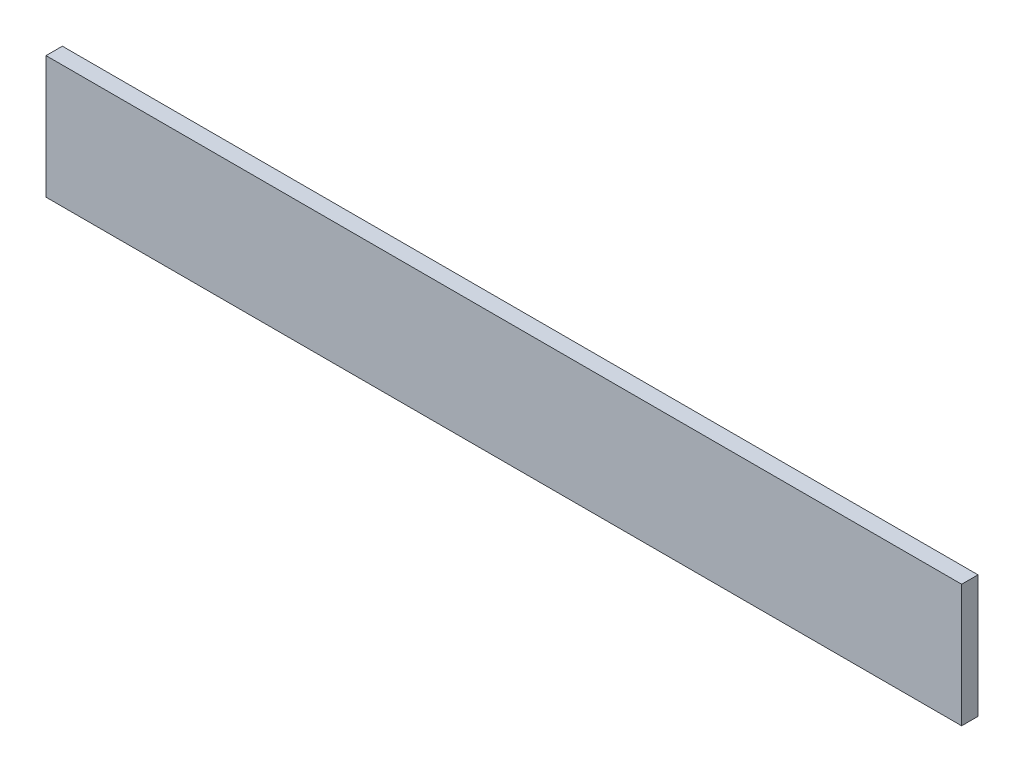
ISO-10303-21;
HEADER;
FILE_DESCRIPTION(('STEP AP214'),'2;1');
FILE_NAME('part.step','',(''),(''),'','','');
FILE_SCHEMA(('AUTOMOTIVE_DESIGN { 1 0 10303 214 1 1 1 1 }'));
ENDSEC;
DATA;
#1=APPLICATION_CONTEXT('core data for automotive mechanical design processes');
#2=APPLICATION_PROTOCOL_DEFINITION('international standard','automotive_design',2000,#1);
#3=PRODUCT_CONTEXT('',#1,'mechanical');
#4=PRODUCT('Part','Part','',(#3));
#5=PRODUCT_RELATED_PRODUCT_CATEGORY('part','',(#4));
#6=PRODUCT_DEFINITION_FORMATION('','',#4);
#7=PRODUCT_DEFINITION_CONTEXT('part definition',#1,'design');
#8=PRODUCT_DEFINITION('design','',#6,#7);
#9=PRODUCT_DEFINITION_SHAPE('','',#8);
#10=(LENGTH_UNIT() NAMED_UNIT(*) SI_UNIT(.MILLI.,.METRE.));
#11=(NAMED_UNIT(*) PLANE_ANGLE_UNIT() SI_UNIT($,.RADIAN.));
#12=(NAMED_UNIT(*) SI_UNIT($,.STERADIAN.) SOLID_ANGLE_UNIT());
#13=UNCERTAINTY_MEASURE_WITH_UNIT(LENGTH_MEASURE(1.E-05),#10,'distance_accuracy_value','');
#14=(GEOMETRIC_REPRESENTATION_CONTEXT(3) GLOBAL_UNCERTAINTY_ASSIGNED_CONTEXT((#13)) GLOBAL_UNIT_ASSIGNED_CONTEXT((#10,
#11,#12)) REPRESENTATION_CONTEXT('',''));
#15=CARTESIAN_POINT('',(0.,0.,0.));
#16=DIRECTION('',(0.,0.,1.));
#17=DIRECTION('',(1.,0.,0.));
#18=AXIS2_PLACEMENT_3D('',#15,#16,#17);
#19=CARTESIAN_POINT('',(0.,-15.,2.));
#20=DIRECTION('',(-1.,0.,0.));
#21=DIRECTION('',(0.,0.,1.));
#22=AXIS2_PLACEMENT_3D('',#19,#20,#21);
#23=PLANE('',#22);
#24=DIRECTION('',(0.,1.,0.));
#25=VECTOR('',#24,1.);
#26=CARTESIAN_POINT('',(0.,-15.,0.));
#27=LINE('',#26,#25);
#28=CARTESIAN_POINT('',(0.,-15.,0.));
#29=VERTEX_POINT('',#28);
#30=CARTESIAN_POINT('',(0.,0.,0.));
#31=VERTEX_POINT('',#30);
#32=EDGE_CURVE('E97',#29,#31,#27,.T.);
#33=ORIENTED_EDGE('',*,*,#32,.T.);
#34=DIRECTION('',(0.,0.,-1.));
#35=VECTOR('',#34,1.);
#36=CARTESIAN_POINT('',(0.,0.,2.));
#37=LINE('',#36,#35);
#38=CARTESIAN_POINT('',(0.,0.,2.));
#39=VERTEX_POINT('',#38);
#40=EDGE_CURVE('E11',#39,#31,#37,.T.);
#41=ORIENTED_EDGE('',*,*,#40,.F.);
#42=DIRECTION('',(0.,1.,0.));
#43=VECTOR('',#42,1.);
#44=CARTESIAN_POINT('',(0.,-15.,2.));
#45=LINE('',#44,#43);
#46=CARTESIAN_POINT('',(0.,-15.,2.));
#47=VERTEX_POINT('',#46);
#48=EDGE_CURVE('E85',#47,#39,#45,.T.);
#49=ORIENTED_EDGE('',*,*,#48,.F.);
#50=DIRECTION('',(0.,0.,-1.));
#51=VECTOR('',#50,1.);
#52=CARTESIAN_POINT('',(0.,-15.,2.));
#53=LINE('',#52,#51);
#54=EDGE_CURVE('E93',#47,#29,#53,.T.);
#55=ORIENTED_EDGE('',*,*,#54,.T.);
#56=EDGE_LOOP('',(#33,#41,#49,#55));
#57=FACE_BOUND('',#56,.T.);
#58=ADVANCED_FACE('F34',(#57),#23,.F.);
#59=CARTESIAN_POINT('',(0.,0.,2.));
#60=DIRECTION('',(0.,-1.,0.));
#61=DIRECTION('',(0.,0.,-1.));
#62=AXIS2_PLACEMENT_3D('',#59,#60,#61);
#63=PLANE('',#62);
#64=DIRECTION('',(-1.,0.,0.));
#65=VECTOR('',#64,1.);
#66=CARTESIAN_POINT('',(0.,0.,0.));
#67=LINE('',#66,#65);
#68=CARTESIAN_POINT('',(-112.,0.,0.));
#69=VERTEX_POINT('',#68);
#70=EDGE_CURVE('E89',#31,#69,#67,.T.);
#71=ORIENTED_EDGE('',*,*,#70,.T.);
#72=DIRECTION('',(0.,0.,-1.));
#73=VECTOR('',#72,1.);
#74=CARTESIAN_POINT('',(-112.,0.,2.));
#75=LINE('',#74,#73);
#76=CARTESIAN_POINT('',(-112.,0.,2.));
#77=VERTEX_POINT('',#76);
#78=EDGE_CURVE('E42',#77,#69,#75,.T.);
#79=ORIENTED_EDGE('',*,*,#78,.F.);
#80=DIRECTION('',(-1.,0.,0.));
#81=VECTOR('',#80,1.);
#82=CARTESIAN_POINT('',(0.,0.,2.));
#83=LINE('',#82,#81);
#84=EDGE_CURVE('E80',#39,#77,#83,.T.);
#85=ORIENTED_EDGE('',*,*,#84,.F.);
#86=ORIENTED_EDGE('',*,*,#40,.T.);
#87=EDGE_LOOP('',(#71,#79,#85,#86));
#88=FACE_BOUND('',#87,.T.);
#89=ADVANCED_FACE('F88',(#88),#63,.F.);
#90=CARTESIAN_POINT('',(-112.,0.,2.));
#91=DIRECTION('',(1.,0.,0.));
#92=DIRECTION('',(0.,0.,-1.));
#93=AXIS2_PLACEMENT_3D('',#90,#91,#92);
#94=PLANE('',#93);
#95=DIRECTION('',(0.,-1.,0.));
#96=VECTOR('',#95,1.);
#97=CARTESIAN_POINT('',(-112.,0.,0.));
#98=LINE('',#97,#96);
#99=CARTESIAN_POINT('',(-112.,-15.,0.));
#100=VERTEX_POINT('',#99);
#101=EDGE_CURVE('E67',#69,#100,#98,.T.);
#102=ORIENTED_EDGE('',*,*,#101,.T.);
#103=DIRECTION('',(0.,0.,-1.));
#104=VECTOR('',#103,1.);
#105=CARTESIAN_POINT('',(-112.,-15.,2.));
#106=LINE('',#105,#104);
#107=CARTESIAN_POINT('',(-112.,-15.,2.));
#108=VERTEX_POINT('',#107);
#109=EDGE_CURVE('E90',#108,#100,#106,.T.);
#110=ORIENTED_EDGE('',*,*,#109,.F.);
#111=DIRECTION('',(0.,-1.,0.));
#112=VECTOR('',#111,1.);
#113=CARTESIAN_POINT('',(-112.,0.,2.));
#114=LINE('',#113,#112);
#115=EDGE_CURVE('E83',#77,#108,#114,.T.);
#116=ORIENTED_EDGE('',*,*,#115,.F.);
#117=ORIENTED_EDGE('',*,*,#78,.T.);
#118=EDGE_LOOP('',(#102,#110,#116,#117));
#119=FACE_BOUND('',#118,.T.);
#120=ADVANCED_FACE('F91',(#119),#94,.F.);
#121=CARTESIAN_POINT('',(-112.,-15.,2.));
#122=DIRECTION('',(0.,1.,0.));
#123=DIRECTION('',(0.,0.,1.));
#124=AXIS2_PLACEMENT_3D('',#121,#122,#123);
#125=PLANE('',#124);
#126=DIRECTION('',(1.,0.,0.));
#127=VECTOR('',#126,1.);
#128=CARTESIAN_POINT('',(-112.,-15.,0.));
#129=LINE('',#128,#127);
#130=EDGE_CURVE('E73',#100,#29,#129,.T.);
#131=ORIENTED_EDGE('',*,*,#130,.T.);
#132=ORIENTED_EDGE('',*,*,#54,.F.);
#133=DIRECTION('',(1.,0.,0.));
#134=VECTOR('',#133,1.);
#135=CARTESIAN_POINT('',(-112.,-15.,2.));
#136=LINE('',#135,#134);
#137=EDGE_CURVE('E50',#108,#47,#136,.T.);
#138=ORIENTED_EDGE('',*,*,#137,.F.);
#139=ORIENTED_EDGE('',*,*,#109,.T.);
#140=EDGE_LOOP('',(#131,#132,#138,#139));
#141=FACE_BOUND('',#140,.T.);
#142=ADVANCED_FACE('F104',(#141),#125,.F.);
#143=CARTESIAN_POINT('',(0.,0.,2.));
#144=DIRECTION('',(0.,0.,1.));
#145=DIRECTION('',(1.,0.,0.));
#146=AXIS2_PLACEMENT_3D('',#143,#144,#145);
#147=PLANE('',#146);
#148=ORIENTED_EDGE('',*,*,#48,.T.);
#149=ORIENTED_EDGE('',*,*,#84,.T.);
#150=ORIENTED_EDGE('',*,*,#115,.T.);
#151=ORIENTED_EDGE('',*,*,#137,.T.);
#152=EDGE_LOOP('',(#148,#149,#150,#151));
#153=FACE_BOUND('',#152,.T.);
#154=ADVANCED_FACE('F81',(#153),#147,.T.);
#155=CARTESIAN_POINT('',(0.,0.,0.));
#156=DIRECTION('',(0.,0.,1.));
#157=DIRECTION('',(1.,0.,0.));
#158=AXIS2_PLACEMENT_3D('',#155,#156,#157);
#159=PLANE('',#158);
#160=ORIENTED_EDGE('',*,*,#32,.F.);
#161=ORIENTED_EDGE('',*,*,#130,.F.);
#162=ORIENTED_EDGE('',*,*,#101,.F.);
#163=ORIENTED_EDGE('',*,*,#70,.F.);
#164=EDGE_LOOP('',(#160,#161,#162,#163));
#165=FACE_BOUND('',#164,.T.);
#166=ADVANCED_FACE('F107',(#165),#159,.F.);
#167=CLOSED_SHELL('',(#58,#89,#120,#142,#154,#166));
#168=MANIFOLD_SOLID_BREP('B2',#167);
#169=ADVANCED_BREP_SHAPE_REPRESENTATION('',(#18,#168),#14);
#170=SHAPE_DEFINITION_REPRESENTATION(#9,#169);
ENDSEC;
END-ISO-10303-21;
